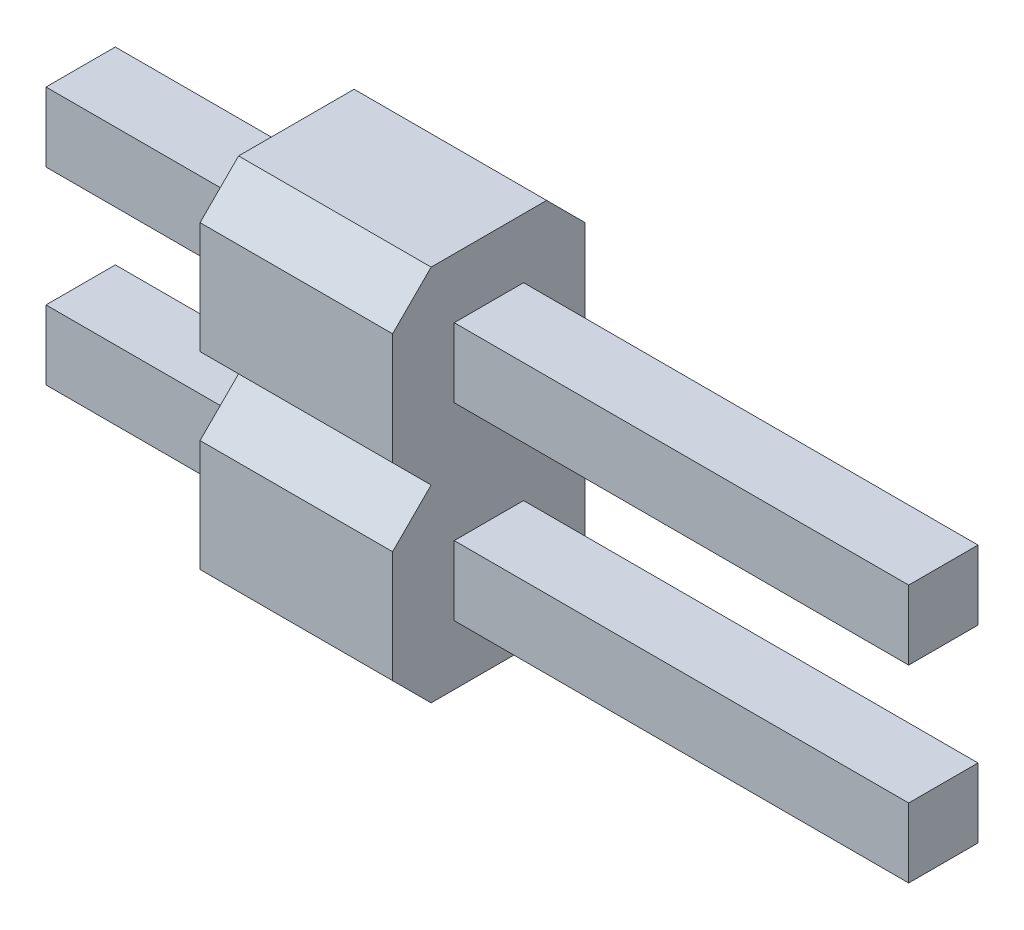
ISO-10303-21;
HEADER;
FILE_DESCRIPTION(('STEP AP214'),'2;1');
FILE_NAME('part.step','',(''),(''),'','','');
FILE_SCHEMA(('AUTOMOTIVE_DESIGN { 1 0 10303 214 1 1 1 1 }'));
ENDSEC;
DATA;
#1=APPLICATION_CONTEXT('core data for automotive mechanical design processes');
#2=APPLICATION_PROTOCOL_DEFINITION('international standard','automotive_design',2000,#1);
#3=PRODUCT_CONTEXT('',#1,'mechanical');
#4=PRODUCT('Part','Part','',(#3));
#5=PRODUCT_RELATED_PRODUCT_CATEGORY('part','',(#4));
#6=PRODUCT_DEFINITION_FORMATION('','',#4);
#7=PRODUCT_DEFINITION_CONTEXT('part definition',#1,'design');
#8=PRODUCT_DEFINITION('design','',#6,#7);
#9=PRODUCT_DEFINITION_SHAPE('','',#8);
#10=(LENGTH_UNIT() NAMED_UNIT(*) SI_UNIT(.MILLI.,.METRE.));
#11=(NAMED_UNIT(*) PLANE_ANGLE_UNIT() SI_UNIT($,.RADIAN.));
#12=(NAMED_UNIT(*) SI_UNIT($,.STERADIAN.) SOLID_ANGLE_UNIT());
#13=UNCERTAINTY_MEASURE_WITH_UNIT(LENGTH_MEASURE(1.E-05),#10,'distance_accuracy_value','');
#14=(GEOMETRIC_REPRESENTATION_CONTEXT(3) GLOBAL_UNCERTAINTY_ASSIGNED_CONTEXT((#13)) GLOBAL_UNIT_ASSIGNED_CONTEXT((#10,
#11,#12)) REPRESENTATION_CONTEXT('',''));
#15=CARTESIAN_POINT('',(0.,0.,0.));
#16=DIRECTION('',(0.,0.,1.));
#17=DIRECTION('',(1.,0.,0.));
#18=AXIS2_PLACEMENT_3D('',#15,#16,#17);
#19=CARTESIAN_POINT('',(-2.5,0.,2.5));
#20=DIRECTION('',(1.,0.,0.));
#21=DIRECTION('',(0.,0.,-1.));
#22=AXIS2_PLACEMENT_3D('',#19,#20,#21);
#23=PLANE('',#22);
#24=DIRECTION('',(0.,0.,1.));
#25=VECTOR('',#24,1.);
#26=CARTESIAN_POINT('',(-2.5,3.225,1.7));
#27=LINE('',#26,#25);
#28=CARTESIAN_POINT('',(-2.5,3.225,0.8));
#29=VERTEX_POINT('',#28);
#30=CARTESIAN_POINT('',(-2.5,3.225,1.7));
#31=VERTEX_POINT('',#30);
#32=EDGE_CURVE('E252',#29,#31,#27,.T.);
#33=ORIENTED_EDGE('',*,*,#32,.F.);
#34=DIRECTION('',(0.,-1.,0.));
#35=VECTOR('',#34,1.);
#36=CARTESIAN_POINT('',(-2.5,3.225,0.8));
#37=LINE('',#36,#35);
#38=CARTESIAN_POINT('',(-2.5,4.125,0.8));
#39=VERTEX_POINT('',#38);
#40=EDGE_CURVE('E265',#39,#29,#37,.T.);
#41=ORIENTED_EDGE('',*,*,#40,.F.);
#42=DIRECTION('',(0.,0.,-1.));
#43=VECTOR('',#42,1.);
#44=CARTESIAN_POINT('',(-2.5,4.125,0.800000000000001));
#45=LINE('',#44,#43);
#46=CARTESIAN_POINT('',(-2.5,4.125,1.7));
#47=VERTEX_POINT('',#46);
#48=EDGE_CURVE('E274',#47,#39,#45,.T.);
#49=ORIENTED_EDGE('',*,*,#48,.F.);
#50=DIRECTION('',(0.,1.,0.));
#51=VECTOR('',#50,1.);
#52=CARTESIAN_POINT('',(-2.5,4.125,1.7));
#53=LINE('',#52,#51);
#54=EDGE_CURVE('E255',#31,#47,#53,.T.);
#55=ORIENTED_EDGE('',*,*,#54,.F.);
#56=EDGE_LOOP('',(#33,#41,#49,#55));
#57=FACE_BOUND('',#56,.T.);
#58=DIRECTION('',(0.,0.,-1.));
#59=VECTOR('',#58,1.);
#60=CARTESIAN_POINT('',(-2.5,4.9,2.5));
#61=LINE('',#60,#59);
#62=CARTESIAN_POINT('',(-2.5,4.9,2.));
#63=VERTEX_POINT('',#62);
#64=CARTESIAN_POINT('',(-2.5,4.9,0.5));
#65=VERTEX_POINT('',#64);
#66=EDGE_CURVE('E42',#63,#65,#61,.T.);
#67=ORIENTED_EDGE('',*,*,#66,.T.);
#68=DIRECTION('',(0.,-0.707106781186547,-0.707106781186548));
#69=VECTOR('',#68,1.);
#70=CARTESIAN_POINT('',(-2.5,4.4,0.));
#71=LINE('',#70,#69);
#72=CARTESIAN_POINT('',(-2.5,4.4,0.));
#73=VERTEX_POINT('',#72);
#74=EDGE_CURVE('E357',#65,#73,#71,.T.);
#75=ORIENTED_EDGE('',*,*,#74,.T.);
#76=DIRECTION('',(0.,-1.,0.));
#77=VECTOR('',#76,1.);
#78=CARTESIAN_POINT('',(-2.5,0.,0.));
#79=LINE('',#78,#77);
#80=CARTESIAN_POINT('',(-2.5,2.95,0.));
#81=VERTEX_POINT('',#80);
#82=EDGE_CURVE('E445',#73,#81,#79,.T.);
#83=ORIENTED_EDGE('',*,*,#82,.T.);
#84=DIRECTION('',(0.,-0.707106781186547,0.707106781186548));
#85=VECTOR('',#84,1.);
#86=CARTESIAN_POINT('',(-2.5,2.95,0.));
#87=LINE('',#86,#85);
#88=CARTESIAN_POINT('',(-2.5,2.45,0.5));
#89=VERTEX_POINT('',#88);
#90=EDGE_CURVE('E397',#81,#89,#87,.T.);
#91=ORIENTED_EDGE('',*,*,#90,.T.);
#92=DIRECTION('',(0.,-0.707106781186547,-0.707106781186548));
#93=VECTOR('',#92,1.);
#94=CARTESIAN_POINT('',(-2.5,2.45,0.5));
#95=LINE('',#94,#93);
#96=CARTESIAN_POINT('',(-2.5,1.95,0.));
#97=VERTEX_POINT('',#96);
#98=EDGE_CURVE('E400',#89,#97,#95,.T.);
#99=ORIENTED_EDGE('',*,*,#98,.T.);
#100=CARTESIAN_POINT('',(-2.5,0.5,0.));
#101=VERTEX_POINT('',#100);
#102=EDGE_CURVE('E444',#97,#101,#79,.T.);
#103=ORIENTED_EDGE('',*,*,#102,.T.);
#104=DIRECTION('',(0.,-0.707106781186548,0.707106781186548));
#105=VECTOR('',#104,1.);
#106=CARTESIAN_POINT('',(-2.5,0.,0.5));
#107=LINE('',#106,#105);
#108=CARTESIAN_POINT('',(-2.5,0.,0.5));
#109=VERTEX_POINT('',#108);
#110=EDGE_CURVE('E367',#101,#109,#107,.T.);
#111=ORIENTED_EDGE('',*,*,#110,.T.);
#112=DIRECTION('',(0.,0.,-1.));
#113=VECTOR('',#112,1.);
#114=CARTESIAN_POINT('',(-2.5,0.,2.5));
#115=LINE('',#114,#113);
#116=CARTESIAN_POINT('',(-2.5,0.,1.99999999999999));
#117=VERTEX_POINT('',#116);
#118=EDGE_CURVE('E449',#117,#109,#115,.T.);
#119=ORIENTED_EDGE('',*,*,#118,.F.);
#120=DIRECTION('',(0.,0.707106781186544,0.707106781186552));
#121=VECTOR('',#120,1.);
#122=CARTESIAN_POINT('',(-2.5,0.5,2.5));
#123=LINE('',#122,#121);
#124=CARTESIAN_POINT('',(-2.5,0.5,2.5));
#125=VERTEX_POINT('',#124);
#126=EDGE_CURVE('E377',#117,#125,#123,.T.);
#127=ORIENTED_EDGE('',*,*,#126,.T.);
#128=DIRECTION('',(0.,-1.,0.));
#129=VECTOR('',#128,1.);
#130=CARTESIAN_POINT('',(-2.5,0.,2.5));
#131=LINE('',#130,#129);
#132=CARTESIAN_POINT('',(-2.5,1.95,2.5));
#133=VERTEX_POINT('',#132);
#134=EDGE_CURVE('E437',#133,#125,#131,.T.);
#135=ORIENTED_EDGE('',*,*,#134,.F.);
#136=DIRECTION('',(0.,0.707106781186548,-0.707106781186548));
#137=VECTOR('',#136,1.);
#138=CARTESIAN_POINT('',(-2.5,2.45,2.));
#139=LINE('',#138,#137);
#140=CARTESIAN_POINT('',(-2.5,2.45,2.));
#141=VERTEX_POINT('',#140);
#142=EDGE_CURVE('E416',#133,#141,#139,.T.);
#143=ORIENTED_EDGE('',*,*,#142,.T.);
#144=DIRECTION('',(0.,0.707106781186548,0.707106781186548));
#145=VECTOR('',#144,1.);
#146=CARTESIAN_POINT('',(-2.5,2.95,2.5));
#147=LINE('',#146,#145);
#148=CARTESIAN_POINT('',(-2.5,2.95,2.5));
#149=VERTEX_POINT('',#148);
#150=EDGE_CURVE('E419',#141,#149,#147,.T.);
#151=ORIENTED_EDGE('',*,*,#150,.T.);
#152=CARTESIAN_POINT('',(-2.5,4.39999999999999,2.5));
#153=VERTEX_POINT('',#152);
#154=EDGE_CURVE('E439',#153,#149,#131,.T.);
#155=ORIENTED_EDGE('',*,*,#154,.F.);
#156=DIRECTION('',(0.,0.707106781186553,-0.707106781186542));
#157=VECTOR('',#156,1.);
#158=CARTESIAN_POINT('',(-2.5,4.9,2.));
#159=LINE('',#158,#157);
#160=EDGE_CURVE('E387',#153,#63,#159,.T.);
#161=ORIENTED_EDGE('',*,*,#160,.T.);
#162=EDGE_LOOP('',(#67,#75,#83,#91,#99,#103,#111,#119,#127,#135,#143,#151,#155,#161));
#163=FACE_BOUND('',#162,.T.);
#164=DIRECTION('',(0.,0.,1.));
#165=VECTOR('',#164,1.);
#166=CARTESIAN_POINT('',(-2.5,0.775,1.7));
#167=LINE('',#166,#165);
#168=CARTESIAN_POINT('',(-2.5,0.775,0.8));
#169=VERTEX_POINT('',#168);
#170=CARTESIAN_POINT('',(-2.5,0.775,1.7));
#171=VERTEX_POINT('',#170);
#172=EDGE_CURVE('E251',#169,#171,#167,.T.);
#173=ORIENTED_EDGE('',*,*,#172,.F.);
#174=DIRECTION('',(0.,-1.,0.));
#175=VECTOR('',#174,1.);
#176=CARTESIAN_POINT('',(-2.5,0.775,0.8));
#177=LINE('',#176,#175);
#178=CARTESIAN_POINT('',(-2.5,1.675,0.8));
#179=VERTEX_POINT('',#178);
#180=EDGE_CURVE('E248',#179,#169,#177,.T.);
#181=ORIENTED_EDGE('',*,*,#180,.F.);
#182=DIRECTION('',(0.,0.,-1.));
#183=VECTOR('',#182,1.);
#184=CARTESIAN_POINT('',(-2.5,1.675,0.8));
#185=LINE('',#184,#183);
#186=CARTESIAN_POINT('',(-2.5,1.675,1.7));
#187=VERTEX_POINT('',#186);
#188=EDGE_CURVE('E54',#187,#179,#185,.T.);
#189=ORIENTED_EDGE('',*,*,#188,.F.);
#190=DIRECTION('',(0.,1.,0.));
#191=VECTOR('',#190,1.);
#192=CARTESIAN_POINT('',(-2.5,1.675,1.7));
#193=LINE('',#192,#191);
#194=EDGE_CURVE('E49',#171,#187,#193,.T.);
#195=ORIENTED_EDGE('',*,*,#194,.F.);
#196=EDGE_LOOP('',(#173,#181,#189,#195));
#197=FACE_BOUND('',#196,.T.);
#198=ADVANCED_FACE('F34',(#57,#163,#197),#23,.F.);
#199=CARTESIAN_POINT('',(0.,0.,2.5));
#200=DIRECTION('',(-1.,0.,0.));
#201=DIRECTION('',(0.,0.,1.));
#202=AXIS2_PLACEMENT_3D('',#199,#200,#201);
#203=PLANE('',#202);
#204=DIRECTION('',(0.,1.,0.));
#205=VECTOR('',#204,1.);
#206=CARTESIAN_POINT('',(0.,4.125,0.800000000000001));
#207=LINE('',#206,#205);
#208=CARTESIAN_POINT('',(0.,3.225,0.8));
#209=VERTEX_POINT('',#208);
#210=CARTESIAN_POINT('',(0.,4.125,0.800000000000001));
#211=VERTEX_POINT('',#210);
#212=EDGE_CURVE('E323',#209,#211,#207,.T.);
#213=ORIENTED_EDGE('',*,*,#212,.F.);
#214=DIRECTION('',(0.,0.,-1.));
#215=VECTOR('',#214,1.);
#216=CARTESIAN_POINT('',(0.,3.225,1.7));
#217=LINE('',#216,#215);
#218=CARTESIAN_POINT('',(0.,3.225,1.7));
#219=VERTEX_POINT('',#218);
#220=EDGE_CURVE('E328',#219,#209,#217,.T.);
#221=ORIENTED_EDGE('',*,*,#220,.F.);
#222=DIRECTION('',(0.,-1.,0.));
#223=VECTOR('',#222,1.);
#224=CARTESIAN_POINT('',(0.,4.125,1.7));
#225=LINE('',#224,#223);
#226=CARTESIAN_POINT('',(0.,4.125,1.7));
#227=VERTEX_POINT('',#226);
#228=EDGE_CURVE('E340',#227,#219,#225,.T.);
#229=ORIENTED_EDGE('',*,*,#228,.F.);
#230=DIRECTION('',(0.,0.,1.));
#231=VECTOR('',#230,1.);
#232=CARTESIAN_POINT('',(0.,4.125,1.7));
#233=LINE('',#232,#231);
#234=EDGE_CURVE('E337',#211,#227,#233,.T.);
#235=ORIENTED_EDGE('',*,*,#234,.F.);
#236=EDGE_LOOP('',(#213,#221,#229,#235));
#237=FACE_BOUND('',#236,.T.);
#238=DIRECTION('',(0.,1.,0.));
#239=VECTOR('',#238,1.);
#240=CARTESIAN_POINT('',(0.,0.,0.));
#241=LINE('',#240,#239);
#242=CARTESIAN_POINT('',(0.,2.95,0.));
#243=VERTEX_POINT('',#242);
#244=CARTESIAN_POINT('',(0.,4.4,0.));
#245=VERTEX_POINT('',#244);
#246=EDGE_CURVE('E430',#243,#245,#241,.T.);
#247=ORIENTED_EDGE('',*,*,#246,.T.);
#248=DIRECTION('',(0.,-0.707106781186547,-0.707106781186548));
#249=VECTOR('',#248,1.);
#250=CARTESIAN_POINT('',(0.,4.4,0.));
#251=LINE('',#250,#249);
#252=CARTESIAN_POINT('',(0.,4.9,0.5));
#253=VERTEX_POINT('',#252);
#254=EDGE_CURVE('E356',#253,#245,#251,.T.);
#255=ORIENTED_EDGE('',*,*,#254,.F.);
#256=DIRECTION('',(0.,0.,-1.));
#257=VECTOR('',#256,1.);
#258=CARTESIAN_POINT('',(0.,4.9,2.5));
#259=LINE('',#258,#257);
#260=CARTESIAN_POINT('',(0.,4.9,2.));
#261=VERTEX_POINT('',#260);
#262=EDGE_CURVE('E11',#261,#253,#259,.T.);
#263=ORIENTED_EDGE('',*,*,#262,.F.);
#264=DIRECTION('',(0.,0.707106781186553,-0.707106781186542));
#265=VECTOR('',#264,1.);
#266=CARTESIAN_POINT('',(0.,4.9,2.));
#267=LINE('',#266,#265);
#268=CARTESIAN_POINT('',(0.,4.39999999999999,2.5));
#269=VERTEX_POINT('',#268);
#270=EDGE_CURVE('E385',#269,#261,#267,.T.);
#271=ORIENTED_EDGE('',*,*,#270,.F.);
#272=DIRECTION('',(0.,1.,0.));
#273=VECTOR('',#272,1.);
#274=CARTESIAN_POINT('',(0.,0.,2.5));
#275=LINE('',#274,#273);
#276=CARTESIAN_POINT('',(0.,2.95,2.5));
#277=VERTEX_POINT('',#276);
#278=EDGE_CURVE('E438',#277,#269,#275,.T.);
#279=ORIENTED_EDGE('',*,*,#278,.F.);
#280=DIRECTION('',(0.,0.707106781186548,0.707106781186548));
#281=VECTOR('',#280,1.);
#282=CARTESIAN_POINT('',(0.,2.95,2.5));
#283=LINE('',#282,#281);
#284=CARTESIAN_POINT('',(0.,2.45,2.));
#285=VERTEX_POINT('',#284);
#286=EDGE_CURVE('E420',#285,#277,#283,.T.);
#287=ORIENTED_EDGE('',*,*,#286,.F.);
#288=DIRECTION('',(0.,0.707106781186548,-0.707106781186548));
#289=VECTOR('',#288,1.);
#290=CARTESIAN_POINT('',(0.,2.45,2.));
#291=LINE('',#290,#289);
#292=CARTESIAN_POINT('',(0.,1.95,2.5));
#293=VERTEX_POINT('',#292);
#294=EDGE_CURVE('E412',#293,#285,#291,.T.);
#295=ORIENTED_EDGE('',*,*,#294,.F.);
#296=CARTESIAN_POINT('',(0.,0.5,2.5));
#297=VERTEX_POINT('',#296);
#298=EDGE_CURVE('E435',#297,#293,#275,.T.);
#299=ORIENTED_EDGE('',*,*,#298,.F.);
#300=DIRECTION('',(0.,0.707106781186544,0.707106781186552));
#301=VECTOR('',#300,1.);
#302=CARTESIAN_POINT('',(0.,0.5,2.5));
#303=LINE('',#302,#301);
#304=CARTESIAN_POINT('',(0.,0.,1.99999999999999));
#305=VERTEX_POINT('',#304);
#306=EDGE_CURVE('E375',#305,#297,#303,.T.);
#307=ORIENTED_EDGE('',*,*,#306,.F.);
#308=DIRECTION('',(0.,0.,-1.));
#309=VECTOR('',#308,1.);
#310=CARTESIAN_POINT('',(0.,0.,2.5));
#311=LINE('',#310,#309);
#312=CARTESIAN_POINT('',(0.,0.,0.5));
#313=VERTEX_POINT('',#312);
#314=EDGE_CURVE('E441',#305,#313,#311,.T.);
#315=ORIENTED_EDGE('',*,*,#314,.T.);
#316=DIRECTION('',(0.,-0.707106781186548,0.707106781186548));
#317=VECTOR('',#316,1.);
#318=CARTESIAN_POINT('',(0.,0.,0.5));
#319=LINE('',#318,#317);
#320=CARTESIAN_POINT('',(0.,0.5,0.));
#321=VERTEX_POINT('',#320);
#322=EDGE_CURVE('E365',#321,#313,#319,.T.);
#323=ORIENTED_EDGE('',*,*,#322,.F.);
#324=CARTESIAN_POINT('',(0.,1.95,0.));
#325=VERTEX_POINT('',#324);
#326=EDGE_CURVE('E442',#321,#325,#241,.T.);
#327=ORIENTED_EDGE('',*,*,#326,.T.);
#328=DIRECTION('',(0.,-0.707106781186547,-0.707106781186548));
#329=VECTOR('',#328,1.);
#330=CARTESIAN_POINT('',(0.,2.45,0.5));
#331=LINE('',#330,#329);
#332=CARTESIAN_POINT('',(0.,2.45,0.5));
#333=VERTEX_POINT('',#332);
#334=EDGE_CURVE('E401',#333,#325,#331,.T.);
#335=ORIENTED_EDGE('',*,*,#334,.F.);
#336=DIRECTION('',(0.,-0.707106781186547,0.707106781186548));
#337=VECTOR('',#336,1.);
#338=CARTESIAN_POINT('',(0.,2.95,0.));
#339=LINE('',#338,#337);
#340=EDGE_CURVE('E395',#243,#333,#339,.T.);
#341=ORIENTED_EDGE('',*,*,#340,.F.);
#342=EDGE_LOOP('',(#247,#255,#263,#271,#279,#287,#295,#299,#307,#315,#323,#327,#335,#341));
#343=FACE_BOUND('',#342,.T.);
#344=DIRECTION('',(0.,1.,0.));
#345=VECTOR('',#344,1.);
#346=CARTESIAN_POINT('',(0.,1.675,0.8));
#347=LINE('',#346,#345);
#348=CARTESIAN_POINT('',(0.,0.775,0.8));
#349=VERTEX_POINT('',#348);
#350=CARTESIAN_POINT('',(0.,1.675,0.8));
#351=VERTEX_POINT('',#350);
#352=EDGE_CURVE('E290',#349,#351,#347,.T.);
#353=ORIENTED_EDGE('',*,*,#352,.F.);
#354=DIRECTION('',(0.,0.,-1.));
#355=VECTOR('',#354,1.);
#356=CARTESIAN_POINT('',(0.,0.775,1.7));
#357=LINE('',#356,#355);
#358=CARTESIAN_POINT('',(0.,0.775,1.7));
#359=VERTEX_POINT('',#358);
#360=EDGE_CURVE('E295',#359,#349,#357,.T.);
#361=ORIENTED_EDGE('',*,*,#360,.F.);
#362=DIRECTION('',(0.,-1.,0.));
#363=VECTOR('',#362,1.);
#364=CARTESIAN_POINT('',(0.,1.675,1.7));
#365=LINE('',#364,#363);
#366=CARTESIAN_POINT('',(0.,1.675,1.7));
#367=VERTEX_POINT('',#366);
#368=EDGE_CURVE('E307',#367,#359,#365,.T.);
#369=ORIENTED_EDGE('',*,*,#368,.F.);
#370=DIRECTION('',(0.,0.,1.));
#371=VECTOR('',#370,1.);
#372=CARTESIAN_POINT('',(0.,1.675,1.7));
#373=LINE('',#372,#371);
#374=EDGE_CURVE('E304',#351,#367,#373,.T.);
#375=ORIENTED_EDGE('',*,*,#374,.F.);
#376=EDGE_LOOP('',(#353,#361,#369,#375));
#377=FACE_BOUND('',#376,.T.);
#378=ADVANCED_FACE('F36',(#237,#343,#377),#203,.F.);
#379=CARTESIAN_POINT('',(0.,0.,0.));
#380=DIRECTION('',(0.,0.,1.));
#381=DIRECTION('',(1.,0.,0.));
#382=AXIS2_PLACEMENT_3D('',#379,#380,#381);
#383=PLANE('',#382);
#384=ORIENTED_EDGE('',*,*,#326,.F.);
#385=DIRECTION('',(1.,0.,0.));
#386=VECTOR('',#385,1.);
#387=CARTESIAN_POINT('',(-2.5,0.5,0.));
#388=LINE('',#387,#386);
#389=EDGE_CURVE('E370',#101,#321,#388,.T.);
#390=ORIENTED_EDGE('',*,*,#389,.F.);
#391=ORIENTED_EDGE('',*,*,#102,.F.);
#392=DIRECTION('',(1.,0.,0.));
#393=VECTOR('',#392,1.);
#394=CARTESIAN_POINT('',(-2.5,1.95,0.));
#395=LINE('',#394,#393);
#396=EDGE_CURVE('E409',#97,#325,#395,.T.);
#397=ORIENTED_EDGE('',*,*,#396,.T.);
#398=EDGE_LOOP('',(#384,#390,#391,#397));
#399=FACE_BOUND('',#398,.T.);
#400=ADVANCED_FACE('F484',(#399),#383,.F.);
#401=CARTESIAN_POINT('',(0.,0.,2.5));
#402=DIRECTION('',(0.,0.,1.));
#403=DIRECTION('',(1.,0.,0.));
#404=AXIS2_PLACEMENT_3D('',#401,#402,#403);
#405=PLANE('',#404);
#406=DIRECTION('',(1.,0.,0.));
#407=VECTOR('',#406,1.);
#408=CARTESIAN_POINT('',(-2.5,4.39999999999999,2.5));
#409=LINE('',#408,#407);
#410=EDGE_CURVE('E390',#153,#269,#409,.T.);
#411=ORIENTED_EDGE('',*,*,#410,.F.);
#412=ORIENTED_EDGE('',*,*,#154,.T.);
#413=DIRECTION('',(1.,0.,0.));
#414=VECTOR('',#413,1.);
#415=CARTESIAN_POINT('',(-2.5,2.95,2.5));
#416=LINE('',#415,#414);
#417=EDGE_CURVE('E427',#149,#277,#416,.T.);
#418=ORIENTED_EDGE('',*,*,#417,.T.);
#419=ORIENTED_EDGE('',*,*,#278,.T.);
#420=EDGE_LOOP('',(#411,#412,#418,#419));
#421=FACE_BOUND('',#420,.T.);
#422=ADVANCED_FACE('F513',(#421),#405,.T.);
#423=CARTESIAN_POINT('',(0.,4.9,2.5));
#424=DIRECTION('',(0.,-1.,0.));
#425=DIRECTION('',(0.,0.,-1.));
#426=AXIS2_PLACEMENT_3D('',#423,#424,#425);
#427=PLANE('',#426);
#428=ORIENTED_EDGE('',*,*,#262,.T.);
#429=DIRECTION('',(1.,0.,0.));
#430=VECTOR('',#429,1.);
#431=CARTESIAN_POINT('',(-2.5,4.9,0.5));
#432=LINE('',#431,#430);
#433=EDGE_CURVE('E360',#65,#253,#432,.T.);
#434=ORIENTED_EDGE('',*,*,#433,.F.);
#435=ORIENTED_EDGE('',*,*,#66,.F.);
#436=DIRECTION('',(1.,0.,0.));
#437=VECTOR('',#436,1.);
#438=CARTESIAN_POINT('',(-2.5,4.9,2.));
#439=LINE('',#438,#437);
#440=EDGE_CURVE('E392',#63,#261,#439,.T.);
#441=ORIENTED_EDGE('',*,*,#440,.T.);
#442=EDGE_LOOP('',(#428,#434,#435,#441));
#443=FACE_BOUND('',#442,.T.);
#444=ADVANCED_FACE('F458',(#443),#427,.F.);
#445=CARTESIAN_POINT('',(0.,0.,2.5));
#446=DIRECTION('',(0.,1.,0.));
#447=DIRECTION('',(-1.,0.,0.));
#448=AXIS2_PLACEMENT_3D('',#445,#446,#447);
#449=PLANE('',#448);
#450=ORIENTED_EDGE('',*,*,#118,.T.);
#451=DIRECTION('',(1.,0.,0.));
#452=VECTOR('',#451,1.);
#453=CARTESIAN_POINT('',(-2.5,0.,0.5));
#454=LINE('',#453,#452);
#455=EDGE_CURVE('E372',#109,#313,#454,.T.);
#456=ORIENTED_EDGE('',*,*,#455,.T.);
#457=ORIENTED_EDGE('',*,*,#314,.F.);
#458=DIRECTION('',(1.,0.,0.));
#459=VECTOR('',#458,1.);
#460=CARTESIAN_POINT('',(-2.5,0.,1.99999999999999));
#461=LINE('',#460,#459);
#462=EDGE_CURVE('E380',#117,#305,#461,.T.);
#463=ORIENTED_EDGE('',*,*,#462,.F.);
#464=EDGE_LOOP('',(#450,#456,#457,#463));
#465=FACE_BOUND('',#464,.T.);
#466=ADVANCED_FACE('F493',(#465),#449,.F.);
#467=DIRECTION('',(1.,0.,0.));
#468=VECTOR('',#467,1.);
#469=CARTESIAN_POINT('',(-2.5,0.5,2.5));
#470=LINE('',#469,#468);
#471=EDGE_CURVE('E382',#125,#297,#470,.T.);
#472=ORIENTED_EDGE('',*,*,#471,.T.);
#473=ORIENTED_EDGE('',*,*,#298,.T.);
#474=DIRECTION('',(1.,0.,0.));
#475=VECTOR('',#474,1.);
#476=CARTESIAN_POINT('',(-2.5,1.95,2.5));
#477=LINE('',#476,#475);
#478=EDGE_CURVE('E423',#133,#293,#477,.T.);
#479=ORIENTED_EDGE('',*,*,#478,.F.);
#480=ORIENTED_EDGE('',*,*,#134,.T.);
#481=EDGE_LOOP('',(#472,#473,#479,#480));
#482=FACE_BOUND('',#481,.T.);
#483=ADVANCED_FACE('F500',(#482),#405,.T.);
#484=ORIENTED_EDGE('',*,*,#82,.F.);
#485=DIRECTION('',(1.,0.,0.));
#486=VECTOR('',#485,1.);
#487=CARTESIAN_POINT('',(-2.5,4.4,0.));
#488=LINE('',#487,#486);
#489=EDGE_CURVE('E362',#73,#245,#488,.T.);
#490=ORIENTED_EDGE('',*,*,#489,.T.);
#491=ORIENTED_EDGE('',*,*,#246,.F.);
#492=DIRECTION('',(1.,0.,0.));
#493=VECTOR('',#492,1.);
#494=CARTESIAN_POINT('',(-2.5,2.95,0.));
#495=LINE('',#494,#493);
#496=EDGE_CURVE('E404',#81,#243,#495,.T.);
#497=ORIENTED_EDGE('',*,*,#496,.F.);
#498=EDGE_LOOP('',(#484,#490,#491,#497));
#499=FACE_BOUND('',#498,.T.);
#500=ADVANCED_FACE('F472',(#499),#383,.F.);
#501=CARTESIAN_POINT('',(-2.5,2.95,2.5));
#502=DIRECTION('',(0.,0.707106781186548,-0.707106781186548));
#503=DIRECTION('',(0.,0.707106781186548,0.707106781186548));
#504=AXIS2_PLACEMENT_3D('',#501,#502,#503);
#505=PLANE('',#504);
#506=ORIENTED_EDGE('',*,*,#286,.T.);
#507=ORIENTED_EDGE('',*,*,#417,.F.);
#508=ORIENTED_EDGE('',*,*,#150,.F.);
#509=DIRECTION('',(1.,0.,0.));
#510=VECTOR('',#509,1.);
#511=CARTESIAN_POINT('',(-2.5,2.45,2.));
#512=LINE('',#511,#510);
#513=EDGE_CURVE('E431',#141,#285,#512,.T.);
#514=ORIENTED_EDGE('',*,*,#513,.T.);
#515=EDGE_LOOP('',(#506,#507,#508,#514));
#516=FACE_BOUND('',#515,.T.);
#517=ADVANCED_FACE('F509',(#516),#505,.F.);
#518=CARTESIAN_POINT('',(-2.5,2.45,2.));
#519=DIRECTION('',(0.,-0.707106781186548,-0.707106781186548));
#520=DIRECTION('',(0.,0.707106781186548,-0.707106781186548));
#521=AXIS2_PLACEMENT_3D('',#518,#519,#520);
#522=PLANE('',#521);
#523=ORIENTED_EDGE('',*,*,#294,.T.);
#524=ORIENTED_EDGE('',*,*,#513,.F.);
#525=ORIENTED_EDGE('',*,*,#142,.F.);
#526=ORIENTED_EDGE('',*,*,#478,.T.);
#527=EDGE_LOOP('',(#523,#524,#525,#526));
#528=FACE_BOUND('',#527,.T.);
#529=ADVANCED_FACE('F503',(#528),#522,.F.);
#530=CARTESIAN_POINT('',(-2.5,2.45,0.5));
#531=DIRECTION('',(0.,-0.707106781186548,0.707106781186547));
#532=DIRECTION('',(0.,-0.707106781186547,-0.707106781186548));
#533=AXIS2_PLACEMENT_3D('',#530,#531,#532);
#534=PLANE('',#533);
#535=ORIENTED_EDGE('',*,*,#334,.T.);
#536=ORIENTED_EDGE('',*,*,#396,.F.);
#537=ORIENTED_EDGE('',*,*,#98,.F.);
#538=DIRECTION('',(1.,0.,0.));
#539=VECTOR('',#538,1.);
#540=CARTESIAN_POINT('',(-2.5,2.45,0.5));
#541=LINE('',#540,#539);
#542=EDGE_CURVE('E413',#89,#333,#541,.T.);
#543=ORIENTED_EDGE('',*,*,#542,.T.);
#544=EDGE_LOOP('',(#535,#536,#537,#543));
#545=FACE_BOUND('',#544,.T.);
#546=ADVANCED_FACE('F478',(#545),#534,.F.);
#547=CARTESIAN_POINT('',(-2.5,2.95,0.));
#548=DIRECTION('',(0.,0.707106781186548,0.707106781186547));
#549=DIRECTION('',(0.,-0.707106781186547,0.707106781186548));
#550=AXIS2_PLACEMENT_3D('',#547,#548,#549);
#551=PLANE('',#550);
#552=ORIENTED_EDGE('',*,*,#340,.T.);
#553=ORIENTED_EDGE('',*,*,#542,.F.);
#554=ORIENTED_EDGE('',*,*,#90,.F.);
#555=ORIENTED_EDGE('',*,*,#496,.T.);
#556=EDGE_LOOP('',(#552,#553,#554,#555));
#557=FACE_BOUND('',#556,.T.);
#558=ADVANCED_FACE('F475',(#557),#551,.F.);
#559=CARTESIAN_POINT('',(-2.5,4.9,2.));
#560=DIRECTION('',(0.,-0.707106781186542,-0.707106781186553));
#561=DIRECTION('',(0.,0.707106781186553,-0.707106781186542));
#562=AXIS2_PLACEMENT_3D('',#559,#560,#561);
#563=PLANE('',#562);
#564=ORIENTED_EDGE('',*,*,#270,.T.);
#565=ORIENTED_EDGE('',*,*,#440,.F.);
#566=ORIENTED_EDGE('',*,*,#160,.F.);
#567=ORIENTED_EDGE('',*,*,#410,.T.);
#568=EDGE_LOOP('',(#564,#565,#566,#567));
#569=FACE_BOUND('',#568,.T.);
#570=ADVANCED_FACE('F515',(#569),#563,.F.);
#571=CARTESIAN_POINT('',(-2.5,0.5,2.5));
#572=DIRECTION('',(0.,0.707106781186552,-0.707106781186544));
#573=DIRECTION('',(0.,0.707106781186544,0.707106781186551));
#574=AXIS2_PLACEMENT_3D('',#571,#572,#573);
#575=PLANE('',#574);
#576=ORIENTED_EDGE('',*,*,#306,.T.);
#577=ORIENTED_EDGE('',*,*,#471,.F.);
#578=ORIENTED_EDGE('',*,*,#126,.F.);
#579=ORIENTED_EDGE('',*,*,#462,.T.);
#580=EDGE_LOOP('',(#576,#577,#578,#579));
#581=FACE_BOUND('',#580,.T.);
#582=ADVANCED_FACE('F517',(#581),#575,.F.);
#583=CARTESIAN_POINT('',(-2.5,0.,0.5));
#584=DIRECTION('',(0.,0.707106781186548,0.707106781186548));
#585=DIRECTION('',(0.,-0.707106781186548,0.707106781186548));
#586=AXIS2_PLACEMENT_3D('',#583,#584,#585);
#587=PLANE('',#586);
#588=ORIENTED_EDGE('',*,*,#322,.T.);
#589=ORIENTED_EDGE('',*,*,#455,.F.);
#590=ORIENTED_EDGE('',*,*,#110,.F.);
#591=ORIENTED_EDGE('',*,*,#389,.T.);
#592=EDGE_LOOP('',(#588,#589,#590,#591));
#593=FACE_BOUND('',#592,.T.);
#594=ADVANCED_FACE('F487',(#593),#587,.F.);
#595=CARTESIAN_POINT('',(-2.5,4.4,0.));
#596=DIRECTION('',(0.,-0.707106781186548,0.707106781186547));
#597=DIRECTION('',(0.,-0.707106781186547,-0.707106781186548));
#598=AXIS2_PLACEMENT_3D('',#595,#596,#597);
#599=PLANE('',#598);
#600=ORIENTED_EDGE('',*,*,#254,.T.);
#601=ORIENTED_EDGE('',*,*,#489,.F.);
#602=ORIENTED_EDGE('',*,*,#74,.F.);
#603=ORIENTED_EDGE('',*,*,#433,.T.);
#604=EDGE_LOOP('',(#600,#601,#602,#603));
#605=FACE_BOUND('',#604,.T.);
#606=ADVANCED_FACE('F462',(#605),#599,.F.);
#607=CARTESIAN_POINT('',(5.9,4.125,0.800000000000001));
#608=DIRECTION('',(0.,0.,1.));
#609=DIRECTION('',(0.,-1.,0.));
#610=AXIS2_PLACEMENT_3D('',#607,#608,#609);
#611=PLANE('',#610);
#612=ORIENTED_EDGE('',*,*,#212,.T.);
#613=DIRECTION('',(-1.,0.,0.));
#614=VECTOR('',#613,1.);
#615=CARTESIAN_POINT('',(5.9,4.125,0.800000000000001));
#616=LINE('',#615,#614);
#617=CARTESIAN_POINT('',(5.9,4.125,0.800000000000001));
#618=VERTEX_POINT('',#617);
#619=EDGE_CURVE('E353',#618,#211,#616,.T.);
#620=ORIENTED_EDGE('',*,*,#619,.F.);
#621=DIRECTION('',(0.,1.,0.));
#622=VECTOR('',#621,1.);
#623=CARTESIAN_POINT('',(5.9,4.125,0.800000000000001));
#624=LINE('',#623,#622);
#625=CARTESIAN_POINT('',(5.9,3.225,0.8));
#626=VERTEX_POINT('',#625);
#627=EDGE_CURVE('E324',#626,#618,#624,.T.);
#628=ORIENTED_EDGE('',*,*,#627,.F.);
#629=DIRECTION('',(-1.,0.,0.));
#630=VECTOR('',#629,1.);
#631=CARTESIAN_POINT('',(5.9,3.225,0.8));
#632=LINE('',#631,#630);
#633=EDGE_CURVE('E334',#626,#209,#632,.T.);
#634=ORIENTED_EDGE('',*,*,#633,.T.);
#635=EDGE_LOOP('',(#612,#620,#628,#634));
#636=FACE_BOUND('',#635,.T.);
#637=ADVANCED_FACE('F592',(#636),#611,.F.);
#638=CARTESIAN_POINT('',(5.9,4.125,1.7));
#639=DIRECTION('',(0.,-1.,0.));
#640=DIRECTION('',(0.,0.,-1.));
#641=AXIS2_PLACEMENT_3D('',#638,#639,#640);
#642=PLANE('',#641);
#643=ORIENTED_EDGE('',*,*,#234,.T.);
#644=DIRECTION('',(-1.,0.,0.));
#645=VECTOR('',#644,1.);
#646=CARTESIAN_POINT('',(5.9,4.125,1.7));
#647=LINE('',#646,#645);
#648=CARTESIAN_POINT('',(5.9,4.125,1.7));
#649=VERTEX_POINT('',#648);
#650=EDGE_CURVE('E350',#649,#227,#647,.T.);
#651=ORIENTED_EDGE('',*,*,#650,.F.);
#652=DIRECTION('',(0.,0.,1.));
#653=VECTOR('',#652,1.);
#654=CARTESIAN_POINT('',(5.9,4.125,1.7));
#655=LINE('',#654,#653);
#656=EDGE_CURVE('E327',#618,#649,#655,.T.);
#657=ORIENTED_EDGE('',*,*,#656,.F.);
#658=ORIENTED_EDGE('',*,*,#619,.T.);
#659=EDGE_LOOP('',(#643,#651,#657,#658));
#660=FACE_BOUND('',#659,.T.);
#661=ADVANCED_FACE('F607',(#660),#642,.F.);
#662=CARTESIAN_POINT('',(5.9,4.125,1.7));
#663=DIRECTION('',(0.,0.,-1.));
#664=DIRECTION('',(0.,1.,0.));
#665=AXIS2_PLACEMENT_3D('',#662,#663,#664);
#666=PLANE('',#665);
#667=ORIENTED_EDGE('',*,*,#228,.T.);
#668=DIRECTION('',(-1.,0.,0.));
#669=VECTOR('',#668,1.);
#670=CARTESIAN_POINT('',(5.9,3.225,1.7));
#671=LINE('',#670,#669);
#672=CARTESIAN_POINT('',(5.9,3.225,1.7));
#673=VERTEX_POINT('',#672);
#674=EDGE_CURVE('E347',#673,#219,#671,.T.);
#675=ORIENTED_EDGE('',*,*,#674,.F.);
#676=DIRECTION('',(0.,-1.,0.));
#677=VECTOR('',#676,1.);
#678=CARTESIAN_POINT('',(5.9,4.125,1.7));
#679=LINE('',#678,#677);
#680=EDGE_CURVE('E330',#649,#673,#679,.T.);
#681=ORIENTED_EDGE('',*,*,#680,.F.);
#682=ORIENTED_EDGE('',*,*,#650,.T.);
#683=EDGE_LOOP('',(#667,#675,#681,#682));
#684=FACE_BOUND('',#683,.T.);
#685=ADVANCED_FACE('F617',(#684),#666,.F.);
#686=CARTESIAN_POINT('',(5.9,3.225,1.7));
#687=DIRECTION('',(0.,1.,0.));
#688=DIRECTION('',(0.,0.,1.));
#689=AXIS2_PLACEMENT_3D('',#686,#687,#688);
#690=PLANE('',#689);
#691=ORIENTED_EDGE('',*,*,#220,.T.);
#692=ORIENTED_EDGE('',*,*,#633,.F.);
#693=DIRECTION('',(0.,0.,-1.));
#694=VECTOR('',#693,1.);
#695=CARTESIAN_POINT('',(5.9,3.225,1.7));
#696=LINE('',#695,#694);
#697=EDGE_CURVE('E332',#673,#626,#696,.T.);
#698=ORIENTED_EDGE('',*,*,#697,.F.);
#699=ORIENTED_EDGE('',*,*,#674,.T.);
#700=EDGE_LOOP('',(#691,#692,#698,#699));
#701=FACE_BOUND('',#700,.T.);
#702=ADVANCED_FACE('F627',(#701),#690,.F.);
#703=CARTESIAN_POINT('',(5.9,0.,0.));
#704=DIRECTION('',(1.,0.,0.));
#705=DIRECTION('',(0.,0.,-1.));
#706=AXIS2_PLACEMENT_3D('',#703,#704,#705);
#707=PLANE('',#706);
#708=ORIENTED_EDGE('',*,*,#627,.T.);
#709=ORIENTED_EDGE('',*,*,#656,.T.);
#710=ORIENTED_EDGE('',*,*,#680,.T.);
#711=ORIENTED_EDGE('',*,*,#697,.T.);
#712=EDGE_LOOP('',(#708,#709,#710,#711));
#713=FACE_BOUND('',#712,.T.);
#714=ADVANCED_FACE('F637',(#713),#707,.T.);
#715=CARTESIAN_POINT('',(5.9,1.675,0.8));
#716=DIRECTION('',(0.,0.,1.));
#717=DIRECTION('',(0.,-1.,0.));
#718=AXIS2_PLACEMENT_3D('',#715,#716,#717);
#719=PLANE('',#718);
#720=ORIENTED_EDGE('',*,*,#352,.T.);
#721=DIRECTION('',(-1.,0.,0.));
#722=VECTOR('',#721,1.);
#723=CARTESIAN_POINT('',(5.9,1.675,0.8));
#724=LINE('',#723,#722);
#725=CARTESIAN_POINT('',(5.9,1.675,0.8));
#726=VERTEX_POINT('',#725);
#727=EDGE_CURVE('E320',#726,#351,#724,.T.);
#728=ORIENTED_EDGE('',*,*,#727,.F.);
#729=DIRECTION('',(0.,1.,0.));
#730=VECTOR('',#729,1.);
#731=CARTESIAN_POINT('',(5.9,1.675,0.8));
#732=LINE('',#731,#730);
#733=CARTESIAN_POINT('',(5.9,0.775,0.8));
#734=VERTEX_POINT('',#733);
#735=EDGE_CURVE('E291',#734,#726,#732,.T.);
#736=ORIENTED_EDGE('',*,*,#735,.F.);
#737=DIRECTION('',(-1.,0.,0.));
#738=VECTOR('',#737,1.);
#739=CARTESIAN_POINT('',(5.9,0.775,0.8));
#740=LINE('',#739,#738);
#741=EDGE_CURVE('E301',#734,#349,#740,.T.);
#742=ORIENTED_EDGE('',*,*,#741,.T.);
#743=EDGE_LOOP('',(#720,#728,#736,#742));
#744=FACE_BOUND('',#743,.T.);
#745=ADVANCED_FACE('F647',(#744),#719,.F.);
#746=CARTESIAN_POINT('',(5.9,1.675,1.7));
#747=DIRECTION('',(0.,-1.,0.));
#748=DIRECTION('',(0.,0.,-1.));
#749=AXIS2_PLACEMENT_3D('',#746,#747,#748);
#750=PLANE('',#749);
#751=ORIENTED_EDGE('',*,*,#374,.T.);
#752=DIRECTION('',(-1.,0.,0.));
#753=VECTOR('',#752,1.);
#754=CARTESIAN_POINT('',(5.9,1.675,1.7));
#755=LINE('',#754,#753);
#756=CARTESIAN_POINT('',(5.9,1.675,1.7));
#757=VERTEX_POINT('',#756);
#758=EDGE_CURVE('E317',#757,#367,#755,.T.);
#759=ORIENTED_EDGE('',*,*,#758,.F.);
#760=DIRECTION('',(0.,0.,1.));
#761=VECTOR('',#760,1.);
#762=CARTESIAN_POINT('',(5.9,1.675,1.7));
#763=LINE('',#762,#761);
#764=EDGE_CURVE('E294',#726,#757,#763,.T.);
#765=ORIENTED_EDGE('',*,*,#764,.F.);
#766=ORIENTED_EDGE('',*,*,#727,.T.);
#767=EDGE_LOOP('',(#751,#759,#765,#766));
#768=FACE_BOUND('',#767,.T.);
#769=ADVANCED_FACE('F657',(#768),#750,.F.);
#770=CARTESIAN_POINT('',(5.9,1.675,1.7));
#771=DIRECTION('',(0.,0.,-1.));
#772=DIRECTION('',(0.,1.,0.));
#773=AXIS2_PLACEMENT_3D('',#770,#771,#772);
#774=PLANE('',#773);
#775=ORIENTED_EDGE('',*,*,#368,.T.);
#776=DIRECTION('',(-1.,0.,0.));
#777=VECTOR('',#776,1.);
#778=CARTESIAN_POINT('',(5.9,0.775,1.7));
#779=LINE('',#778,#777);
#780=CARTESIAN_POINT('',(5.9,0.775,1.7));
#781=VERTEX_POINT('',#780);
#782=EDGE_CURVE('E314',#781,#359,#779,.T.);
#783=ORIENTED_EDGE('',*,*,#782,.F.);
#784=DIRECTION('',(0.,-1.,0.));
#785=VECTOR('',#784,1.);
#786=CARTESIAN_POINT('',(5.9,1.675,1.7));
#787=LINE('',#786,#785);
#788=EDGE_CURVE('E297',#757,#781,#787,.T.);
#789=ORIENTED_EDGE('',*,*,#788,.F.);
#790=ORIENTED_EDGE('',*,*,#758,.T.);
#791=EDGE_LOOP('',(#775,#783,#789,#790));
#792=FACE_BOUND('',#791,.T.);
#793=ADVANCED_FACE('F667',(#792),#774,.F.);
#794=CARTESIAN_POINT('',(5.9,0.775,1.7));
#795=DIRECTION('',(0.,1.,0.));
#796=DIRECTION('',(0.,0.,1.));
#797=AXIS2_PLACEMENT_3D('',#794,#795,#796);
#798=PLANE('',#797);
#799=ORIENTED_EDGE('',*,*,#360,.T.);
#800=ORIENTED_EDGE('',*,*,#741,.F.);
#801=DIRECTION('',(0.,0.,-1.));
#802=VECTOR('',#801,1.);
#803=CARTESIAN_POINT('',(5.9,0.775,1.7));
#804=LINE('',#803,#802);
#805=EDGE_CURVE('E299',#781,#734,#804,.T.);
#806=ORIENTED_EDGE('',*,*,#805,.F.);
#807=ORIENTED_EDGE('',*,*,#782,.T.);
#808=EDGE_LOOP('',(#799,#800,#806,#807));
#809=FACE_BOUND('',#808,.T.);
#810=ADVANCED_FACE('F677',(#809),#798,.F.);
#811=CARTESIAN_POINT('',(5.9,0.,0.));
#812=DIRECTION('',(1.,0.,0.));
#813=DIRECTION('',(0.,0.,-1.));
#814=AXIS2_PLACEMENT_3D('',#811,#812,#813);
#815=PLANE('',#814);
#816=ORIENTED_EDGE('',*,*,#735,.T.);
#817=ORIENTED_EDGE('',*,*,#764,.T.);
#818=ORIENTED_EDGE('',*,*,#788,.T.);
#819=ORIENTED_EDGE('',*,*,#805,.T.);
#820=EDGE_LOOP('',(#816,#817,#818,#819));
#821=FACE_BOUND('',#820,.T.);
#822=ADVANCED_FACE('F687',(#821),#815,.T.);
#823=CARTESIAN_POINT('',(-5.3,3.225,1.7));
#824=DIRECTION('',(0.,1.,0.));
#825=DIRECTION('',(0.,0.,1.));
#826=AXIS2_PLACEMENT_3D('',#823,#824,#825);
#827=PLANE('',#826);
#828=ORIENTED_EDGE('',*,*,#32,.T.);
#829=DIRECTION('',(1.,0.,0.));
#830=VECTOR('',#829,1.);
#831=CARTESIAN_POINT('',(-5.3,3.225,1.7));
#832=LINE('',#831,#830);
#833=CARTESIAN_POINT('',(-5.3,3.225,1.7));
#834=VERTEX_POINT('',#833);
#835=EDGE_CURVE('E287',#834,#31,#832,.T.);
#836=ORIENTED_EDGE('',*,*,#835,.F.);
#837=DIRECTION('',(0.,0.,1.));
#838=VECTOR('',#837,1.);
#839=CARTESIAN_POINT('',(-5.3,3.225,1.7));
#840=LINE('',#839,#838);
#841=CARTESIAN_POINT('',(-5.3,3.225,0.8));
#842=VERTEX_POINT('',#841);
#843=EDGE_CURVE('E261',#842,#834,#840,.T.);
#844=ORIENTED_EDGE('',*,*,#843,.F.);
#845=DIRECTION('',(1.,0.,0.));
#846=VECTOR('',#845,1.);
#847=CARTESIAN_POINT('',(-5.3,3.225,0.8));
#848=LINE('',#847,#846);
#849=EDGE_CURVE('E270',#842,#29,#848,.T.);
#850=ORIENTED_EDGE('',*,*,#849,.T.);
#851=EDGE_LOOP('',(#828,#836,#844,#850));
#852=FACE_BOUND('',#851,.T.);
#853=ADVANCED_FACE('F696',(#852),#827,.F.);
#854=CARTESIAN_POINT('',(-5.3,4.125,1.7));
#855=DIRECTION('',(0.,0.,-1.));
#856=DIRECTION('',(0.,1.,0.));
#857=AXIS2_PLACEMENT_3D('',#854,#855,#856);
#858=PLANE('',#857);
#859=ORIENTED_EDGE('',*,*,#54,.T.);
#860=DIRECTION('',(1.,0.,0.));
#861=VECTOR('',#860,1.);
#862=CARTESIAN_POINT('',(-5.3,4.125,1.7));
#863=LINE('',#862,#861);
#864=CARTESIAN_POINT('',(-5.3,4.125,1.7));
#865=VERTEX_POINT('',#864);
#866=EDGE_CURVE('E284',#865,#47,#863,.T.);
#867=ORIENTED_EDGE('',*,*,#866,.F.);
#868=DIRECTION('',(0.,1.,0.));
#869=VECTOR('',#868,1.);
#870=CARTESIAN_POINT('',(-5.3,4.125,1.7));
#871=LINE('',#870,#869);
#872=EDGE_CURVE('E264',#834,#865,#871,.T.);
#873=ORIENTED_EDGE('',*,*,#872,.F.);
#874=ORIENTED_EDGE('',*,*,#835,.T.);
#875=EDGE_LOOP('',(#859,#867,#873,#874));
#876=FACE_BOUND('',#875,.T.);
#877=ADVANCED_FACE('F711',(#876),#858,.F.);
#878=CARTESIAN_POINT('',(-5.3,4.125,0.800000000000001));
#879=DIRECTION('',(0.,-1.,0.));
#880=DIRECTION('',(0.,0.,-1.));
#881=AXIS2_PLACEMENT_3D('',#878,#879,#880);
#882=PLANE('',#881);
#883=ORIENTED_EDGE('',*,*,#48,.T.);
#884=DIRECTION('',(1.,0.,0.));
#885=VECTOR('',#884,1.);
#886=CARTESIAN_POINT('',(-5.3,4.125,0.800000000000001));
#887=LINE('',#886,#885);
#888=CARTESIAN_POINT('',(-5.3,4.125,0.800000000000001));
#889=VERTEX_POINT('',#888);
#890=EDGE_CURVE('E281',#889,#39,#887,.T.);
#891=ORIENTED_EDGE('',*,*,#890,.F.);
#892=DIRECTION('',(0.,0.,-1.));
#893=VECTOR('',#892,1.);
#894=CARTESIAN_POINT('',(-5.3,4.125,0.800000000000001));
#895=LINE('',#894,#893);
#896=EDGE_CURVE('E267',#865,#889,#895,.T.);
#897=ORIENTED_EDGE('',*,*,#896,.F.);
#898=ORIENTED_EDGE('',*,*,#866,.T.);
#899=EDGE_LOOP('',(#883,#891,#897,#898));
#900=FACE_BOUND('',#899,.T.);
#901=ADVANCED_FACE('F721',(#900),#882,.F.);
#902=CARTESIAN_POINT('',(-5.3,3.225,0.8));
#903=DIRECTION('',(0.,0.,1.));
#904=DIRECTION('',(0.,-1.,0.));
#905=AXIS2_PLACEMENT_3D('',#902,#903,#904);
#906=PLANE('',#905);
#907=ORIENTED_EDGE('',*,*,#40,.T.);
#908=ORIENTED_EDGE('',*,*,#849,.F.);
#909=DIRECTION('',(0.,-1.,0.));
#910=VECTOR('',#909,1.);
#911=CARTESIAN_POINT('',(-5.3,3.225,0.8));
#912=LINE('',#911,#910);
#913=EDGE_CURVE('E269',#889,#842,#912,.T.);
#914=ORIENTED_EDGE('',*,*,#913,.F.);
#915=ORIENTED_EDGE('',*,*,#890,.T.);
#916=EDGE_LOOP('',(#907,#908,#914,#915));
#917=FACE_BOUND('',#916,.T.);
#918=ADVANCED_FACE('F731',(#917),#906,.F.);
#919=CARTESIAN_POINT('',(-5.3,0.,0.));
#920=DIRECTION('',(1.,0.,0.));
#921=DIRECTION('',(0.,0.,-1.));
#922=AXIS2_PLACEMENT_3D('',#919,#920,#921);
#923=PLANE('',#922);
#924=ORIENTED_EDGE('',*,*,#843,.T.);
#925=ORIENTED_EDGE('',*,*,#872,.T.);
#926=ORIENTED_EDGE('',*,*,#896,.T.);
#927=ORIENTED_EDGE('',*,*,#913,.T.);
#928=EDGE_LOOP('',(#924,#925,#926,#927));
#929=FACE_BOUND('',#928,.T.);
#930=ADVANCED_FACE('F741',(#929),#923,.F.);
#931=CARTESIAN_POINT('',(-5.3,0.775,1.7));
#932=DIRECTION('',(0.,1.,0.));
#933=DIRECTION('',(0.,0.,1.));
#934=AXIS2_PLACEMENT_3D('',#931,#932,#933);
#935=PLANE('',#934);
#936=ORIENTED_EDGE('',*,*,#172,.T.);
#937=DIRECTION('',(1.,0.,0.));
#938=VECTOR('',#937,1.);
#939=CARTESIAN_POINT('',(-5.3,0.775,1.7));
#940=LINE('',#939,#938);
#941=CARTESIAN_POINT('',(-5.3,0.775,1.7));
#942=VERTEX_POINT('',#941);
#943=EDGE_CURVE('E232',#942,#171,#940,.T.);
#944=ORIENTED_EDGE('',*,*,#943,.F.);
#945=DIRECTION('',(0.,0.,1.));
#946=VECTOR('',#945,1.);
#947=CARTESIAN_POINT('',(-5.3,0.775,1.7));
#948=LINE('',#947,#946);
#949=CARTESIAN_POINT('',(-5.3,0.775,0.8));
#950=VERTEX_POINT('',#949);
#951=EDGE_CURVE('E239',#950,#942,#948,.T.);
#952=ORIENTED_EDGE('',*,*,#951,.F.);
#953=DIRECTION('',(1.,0.,0.));
#954=VECTOR('',#953,1.);
#955=CARTESIAN_POINT('',(-5.3,0.775,0.8));
#956=LINE('',#955,#954);
#957=EDGE_CURVE('E801',#950,#169,#956,.T.);
#958=ORIENTED_EDGE('',*,*,#957,.T.);
#959=EDGE_LOOP('',(#936,#944,#952,#958));
#960=FACE_BOUND('',#959,.T.);
#961=ADVANCED_FACE('F250',(#960),#935,.F.);
#962=CARTESIAN_POINT('',(-5.3,1.675,1.7));
#963=DIRECTION('',(0.,0.,-1.));
#964=DIRECTION('',(0.,1.,0.));
#965=AXIS2_PLACEMENT_3D('',#962,#963,#964);
#966=PLANE('',#965);
#967=ORIENTED_EDGE('',*,*,#194,.T.);
#968=DIRECTION('',(1.,0.,0.));
#969=VECTOR('',#968,1.);
#970=CARTESIAN_POINT('',(-5.3,1.675,1.7));
#971=LINE('',#970,#969);
#972=CARTESIAN_POINT('',(-5.3,1.675,1.7));
#973=VERTEX_POINT('',#972);
#974=EDGE_CURVE('E235',#973,#187,#971,.T.);
#975=ORIENTED_EDGE('',*,*,#974,.F.);
#976=DIRECTION('',(0.,1.,0.));
#977=VECTOR('',#976,1.);
#978=CARTESIAN_POINT('',(-5.3,1.675,1.7));
#979=LINE('',#978,#977);
#980=EDGE_CURVE('E228',#942,#973,#979,.T.);
#981=ORIENTED_EDGE('',*,*,#980,.F.);
#982=ORIENTED_EDGE('',*,*,#943,.T.);
#983=EDGE_LOOP('',(#967,#975,#981,#982));
#984=FACE_BOUND('',#983,.T.);
#985=ADVANCED_FACE('F230',(#984),#966,.F.);
#986=CARTESIAN_POINT('',(-5.3,1.675,0.8));
#987=DIRECTION('',(0.,-1.,0.));
#988=DIRECTION('',(0.,0.,-1.));
#989=AXIS2_PLACEMENT_3D('',#986,#987,#988);
#990=PLANE('',#989);
#991=ORIENTED_EDGE('',*,*,#188,.T.);
#992=DIRECTION('',(1.,0.,0.));
#993=VECTOR('',#992,1.);
#994=CARTESIAN_POINT('',(-5.3,1.675,0.8));
#995=LINE('',#994,#993);
#996=CARTESIAN_POINT('',(-5.3,1.675,0.8));
#997=VERTEX_POINT('',#996);
#998=EDGE_CURVE('E257',#997,#179,#995,.T.);
#999=ORIENTED_EDGE('',*,*,#998,.F.);
#1000=DIRECTION('',(0.,0.,-1.));
#1001=VECTOR('',#1000,1.);
#1002=CARTESIAN_POINT('',(-5.3,1.675,0.8));
#1003=LINE('',#1002,#1001);
#1004=EDGE_CURVE('E238',#973,#997,#1003,.T.);
#1005=ORIENTED_EDGE('',*,*,#1004,.F.);
#1006=ORIENTED_EDGE('',*,*,#974,.T.);
#1007=EDGE_LOOP('',(#991,#999,#1005,#1006));
#1008=FACE_BOUND('',#1007,.T.);
#1009=ADVANCED_FACE('F768',(#1008),#990,.F.);
#1010=CARTESIAN_POINT('',(-5.3,0.775,0.8));
#1011=DIRECTION('',(0.,0.,1.));
#1012=DIRECTION('',(0.,-1.,0.));
#1013=AXIS2_PLACEMENT_3D('',#1010,#1011,#1012);
#1014=PLANE('',#1013);
#1015=ORIENTED_EDGE('',*,*,#180,.T.);
#1016=ORIENTED_EDGE('',*,*,#957,.F.);
#1017=DIRECTION('',(0.,-1.,0.));
#1018=VECTOR('',#1017,1.);
#1019=CARTESIAN_POINT('',(-5.3,0.775,0.8));
#1020=LINE('',#1019,#1018);
#1021=EDGE_CURVE('E244',#997,#950,#1020,.T.);
#1022=ORIENTED_EDGE('',*,*,#1021,.F.);
#1023=ORIENTED_EDGE('',*,*,#998,.T.);
#1024=EDGE_LOOP('',(#1015,#1016,#1022,#1023));
#1025=FACE_BOUND('',#1024,.T.);
#1026=ADVANCED_FACE('F777',(#1025),#1014,.F.);
#1027=CARTESIAN_POINT('',(-5.3,0.,0.));
#1028=DIRECTION('',(1.,0.,0.));
#1029=DIRECTION('',(0.,0.,-1.));
#1030=AXIS2_PLACEMENT_3D('',#1027,#1028,#1029);
#1031=PLANE('',#1030);
#1032=ORIENTED_EDGE('',*,*,#951,.T.);
#1033=ORIENTED_EDGE('',*,*,#980,.T.);
#1034=ORIENTED_EDGE('',*,*,#1004,.T.);
#1035=ORIENTED_EDGE('',*,*,#1021,.T.);
#1036=EDGE_LOOP('',(#1032,#1033,#1034,#1035));
#1037=FACE_BOUND('',#1036,.T.);
#1038=ADVANCED_FACE('F242',(#1037),#1031,.F.);
#1039=CLOSED_SHELL('',(#198,#378,#400,#422,#444,#466,#483,#500,#517,#529,#546,#558,#570,#582,
#594,#606,#637,#661,#685,#702,#714,#745,#769,#793,#810,#822,#853,#877,#901,#918,#930,#961,#985,
#1009,#1026,#1038));
#1040=MANIFOLD_SOLID_BREP('B2',#1039);
#1041=ADVANCED_BREP_SHAPE_REPRESENTATION('',(#18,#1040),#14);
#1042=SHAPE_DEFINITION_REPRESENTATION(#9,#1041);
ENDSEC;
END-ISO-10303-21;
